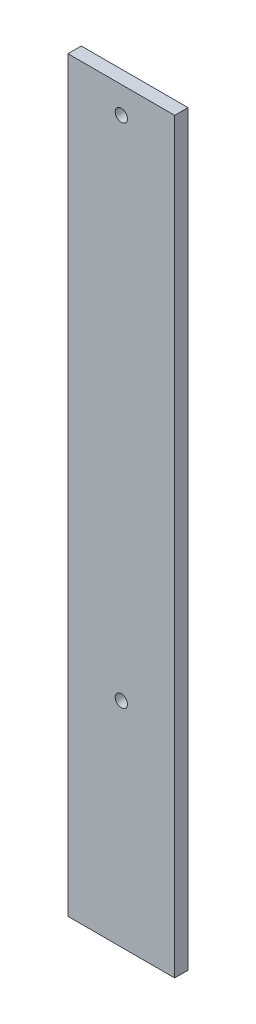
ISO-10303-21;
HEADER;
FILE_DESCRIPTION(('STEP AP214'),'2;1');
FILE_NAME('part.step','',(''),(''),'','','');
FILE_SCHEMA(('AUTOMOTIVE_DESIGN { 1 0 10303 214 1 1 1 1 }'));
ENDSEC;
DATA;
#1=APPLICATION_CONTEXT('core data for automotive mechanical design processes');
#2=APPLICATION_PROTOCOL_DEFINITION('international standard','automotive_design',2000,#1);
#3=PRODUCT_CONTEXT('',#1,'mechanical');
#4=PRODUCT('Part','Part','',(#3));
#5=PRODUCT_RELATED_PRODUCT_CATEGORY('part','',(#4));
#6=PRODUCT_DEFINITION_FORMATION('','',#4);
#7=PRODUCT_DEFINITION_CONTEXT('part definition',#1,'design');
#8=PRODUCT_DEFINITION('design','',#6,#7);
#9=PRODUCT_DEFINITION_SHAPE('','',#8);
#10=(LENGTH_UNIT() NAMED_UNIT(*) SI_UNIT(.MILLI.,.METRE.));
#11=(NAMED_UNIT(*) PLANE_ANGLE_UNIT() SI_UNIT($,.RADIAN.));
#12=(NAMED_UNIT(*) SI_UNIT($,.STERADIAN.) SOLID_ANGLE_UNIT());
#13=UNCERTAINTY_MEASURE_WITH_UNIT(LENGTH_MEASURE(1.E-05),#10,'distance_accuracy_value','');
#14=(GEOMETRIC_REPRESENTATION_CONTEXT(3) GLOBAL_UNCERTAINTY_ASSIGNED_CONTEXT((#13)) GLOBAL_UNIT_ASSIGNED_CONTEXT((#10,
#11,#12)) REPRESENTATION_CONTEXT('',''));
#15=CARTESIAN_POINT('',(0.,0.,0.));
#16=DIRECTION('',(0.,0.,1.));
#17=DIRECTION('',(1.,0.,0.));
#18=AXIS2_PLACEMENT_3D('',#15,#16,#17);
#19=CARTESIAN_POINT('',(0.,0.,3.175));
#20=DIRECTION('',(0.,0.,-1.));
#21=DIRECTION('',(-1.,0.,0.));
#22=AXIS2_PLACEMENT_3D('',#19,#20,#21);
#23=PLANE('',#22);
#24=DIRECTION('',(0.,-1.,0.));
#25=VECTOR('',#24,1.);
#26=CARTESIAN_POINT('',(0.,0.,3.175));
#27=LINE('',#26,#25);
#28=CARTESIAN_POINT('',(0.,177.8,3.175));
#29=VERTEX_POINT('',#28);
#30=CARTESIAN_POINT('',(0.,0.,3.175));
#31=VERTEX_POINT('',#30);
#32=EDGE_CURVE('E98',#29,#31,#27,.T.);
#33=ORIENTED_EDGE('',*,*,#32,.T.);
#34=DIRECTION('',(1.,0.,0.));
#35=VECTOR('',#34,1.);
#36=CARTESIAN_POINT('',(0.,0.,3.175));
#37=LINE('',#36,#35);
#38=CARTESIAN_POINT('',(25.4,0.,3.175));
#39=VERTEX_POINT('',#38);
#40=EDGE_CURVE('E93',#31,#39,#37,.T.);
#41=ORIENTED_EDGE('',*,*,#40,.T.);
#42=DIRECTION('',(0.,1.,0.));
#43=VECTOR('',#42,1.);
#44=CARTESIAN_POINT('',(25.4,0.,3.175));
#45=LINE('',#44,#43);
#46=CARTESIAN_POINT('',(25.4,177.8,3.175));
#47=VERTEX_POINT('',#46);
#48=EDGE_CURVE('E96',#39,#47,#45,.T.);
#49=ORIENTED_EDGE('',*,*,#48,.T.);
#50=DIRECTION('',(-1.,0.,0.));
#51=VECTOR('',#50,1.);
#52=CARTESIAN_POINT('',(0.,177.8,3.175));
#53=LINE('',#52,#51);
#54=EDGE_CURVE('E63',#47,#29,#53,.T.);
#55=ORIENTED_EDGE('',*,*,#54,.T.);
#56=EDGE_LOOP('',(#33,#41,#49,#55));
#57=FACE_BOUND('',#56,.T.);
#58=CARTESIAN_POINT('',(12.7,171.45,3.175));
#59=DIRECTION('',(0.,0.,1.));
#60=DIRECTION('',(1.,0.,0.));
#61=AXIS2_PLACEMENT_3D('',#58,#59,#60);
#62=CIRCLE('',#61,1.4605);
#63=CARTESIAN_POINT('',(14.1605,171.45,3.175));
#64=VERTEX_POINT('',#63);
#65=EDGE_CURVE('E118',#64,#64,#62,.T.);
#66=ORIENTED_EDGE('',*,*,#65,.F.);
#67=EDGE_LOOP('',(#66));
#68=FACE_BOUND('',#67,.T.);
#69=CARTESIAN_POINT('',(12.7,50.8,3.175));
#70=DIRECTION('',(0.,0.,1.));
#71=DIRECTION('',(1.,0.,0.));
#72=AXIS2_PLACEMENT_3D('',#69,#70,#71);
#73=CIRCLE('',#72,1.4605);
#74=CARTESIAN_POINT('',(14.1605,50.8,3.175));
#75=VERTEX_POINT('',#74);
#76=EDGE_CURVE('E140',#75,#75,#73,.T.);
#77=ORIENTED_EDGE('',*,*,#76,.F.);
#78=EDGE_LOOP('',(#77));
#79=FACE_BOUND('',#78,.T.);
#80=ADVANCED_FACE('F45',(#57,#68,#79),#23,.F.);
#81=CARTESIAN_POINT('',(0.,0.,0.));
#82=DIRECTION('',(0.,0.,-1.));
#83=DIRECTION('',(-1.,0.,0.));
#84=AXIS2_PLACEMENT_3D('',#81,#82,#83);
#85=PLANE('',#84);
#86=CARTESIAN_POINT('',(12.7,171.45,0.));
#87=DIRECTION('',(0.,0.,1.));
#88=DIRECTION('',(1.,0.,0.));
#89=AXIS2_PLACEMENT_3D('',#86,#87,#88);
#90=CIRCLE('',#89,1.4605);
#91=CARTESIAN_POINT('',(14.1605,171.45,0.));
#92=VERTEX_POINT('',#91);
#93=EDGE_CURVE('E136',#92,#92,#90,.T.);
#94=ORIENTED_EDGE('',*,*,#93,.T.);
#95=EDGE_LOOP('',(#94));
#96=FACE_BOUND('',#95,.T.);
#97=DIRECTION('',(0.,-1.,0.));
#98=VECTOR('',#97,1.);
#99=CARTESIAN_POINT('',(0.,0.,0.));
#100=LINE('',#99,#98);
#101=CARTESIAN_POINT('',(0.,177.8,0.));
#102=VERTEX_POINT('',#101);
#103=CARTESIAN_POINT('',(0.,0.,0.));
#104=VERTEX_POINT('',#103);
#105=EDGE_CURVE('E114',#102,#104,#100,.T.);
#106=ORIENTED_EDGE('',*,*,#105,.F.);
#107=DIRECTION('',(-1.,0.,0.));
#108=VECTOR('',#107,1.);
#109=CARTESIAN_POINT('',(0.,177.8,0.));
#110=LINE('',#109,#108);
#111=CARTESIAN_POINT('',(25.4,177.8,0.));
#112=VERTEX_POINT('',#111);
#113=EDGE_CURVE('E86',#112,#102,#110,.T.);
#114=ORIENTED_EDGE('',*,*,#113,.F.);
#115=DIRECTION('',(0.,1.,0.));
#116=VECTOR('',#115,1.);
#117=CARTESIAN_POINT('',(25.4,0.,0.));
#118=LINE('',#117,#116);
#119=CARTESIAN_POINT('',(25.4,0.,0.));
#120=VERTEX_POINT('',#119);
#121=EDGE_CURVE('E80',#120,#112,#118,.T.);
#122=ORIENTED_EDGE('',*,*,#121,.F.);
#123=DIRECTION('',(1.,0.,0.));
#124=VECTOR('',#123,1.);
#125=CARTESIAN_POINT('',(0.,0.,0.));
#126=LINE('',#125,#124);
#127=EDGE_CURVE('E103',#104,#120,#126,.T.);
#128=ORIENTED_EDGE('',*,*,#127,.F.);
#129=EDGE_LOOP('',(#106,#114,#122,#128));
#130=FACE_BOUND('',#129,.T.);
#131=CARTESIAN_POINT('',(12.7,50.8,0.));
#132=DIRECTION('',(0.,0.,1.));
#133=DIRECTION('',(1.,0.,0.));
#134=AXIS2_PLACEMENT_3D('',#131,#132,#133);
#135=CIRCLE('',#134,1.4605);
#136=CARTESIAN_POINT('',(14.1605,50.8,0.));
#137=VERTEX_POINT('',#136);
#138=EDGE_CURVE('E144',#137,#137,#135,.T.);
#139=ORIENTED_EDGE('',*,*,#138,.T.);
#140=EDGE_LOOP('',(#139));
#141=FACE_BOUND('',#140,.T.);
#142=ADVANCED_FACE('F131',(#96,#130,#141),#85,.T.);
#143=CARTESIAN_POINT('',(0.,0.,3.175));
#144=DIRECTION('',(1.,0.,0.));
#145=DIRECTION('',(0.,0.,-1.));
#146=AXIS2_PLACEMENT_3D('',#143,#144,#145);
#147=PLANE('',#146);
#148=ORIENTED_EDGE('',*,*,#105,.T.);
#149=DIRECTION('',(0.,0.,-1.));
#150=VECTOR('',#149,1.);
#151=CARTESIAN_POINT('',(0.,0.,3.175));
#152=LINE('',#151,#150);
#153=EDGE_CURVE('E11',#31,#104,#152,.T.);
#154=ORIENTED_EDGE('',*,*,#153,.F.);
#155=ORIENTED_EDGE('',*,*,#32,.F.);
#156=DIRECTION('',(0.,0.,-1.));
#157=VECTOR('',#156,1.);
#158=CARTESIAN_POINT('',(0.,177.8,3.175));
#159=LINE('',#158,#157);
#160=EDGE_CURVE('E110',#29,#102,#159,.T.);
#161=ORIENTED_EDGE('',*,*,#160,.T.);
#162=EDGE_LOOP('',(#148,#154,#155,#161));
#163=FACE_BOUND('',#162,.T.);
#164=ADVANCED_FACE('F47',(#163),#147,.F.);
#165=CARTESIAN_POINT('',(0.,0.,3.175));
#166=DIRECTION('',(0.,1.,0.));
#167=DIRECTION('',(0.,0.,1.));
#168=AXIS2_PLACEMENT_3D('',#165,#166,#167);
#169=PLANE('',#168);
#170=ORIENTED_EDGE('',*,*,#127,.T.);
#171=DIRECTION('',(0.,0.,-1.));
#172=VECTOR('',#171,1.);
#173=CARTESIAN_POINT('',(25.4,0.,3.175));
#174=LINE('',#173,#172);
#175=EDGE_CURVE('E55',#39,#120,#174,.T.);
#176=ORIENTED_EDGE('',*,*,#175,.F.);
#177=ORIENTED_EDGE('',*,*,#40,.F.);
#178=ORIENTED_EDGE('',*,*,#153,.T.);
#179=EDGE_LOOP('',(#170,#176,#177,#178));
#180=FACE_BOUND('',#179,.T.);
#181=ADVANCED_FACE('F102',(#180),#169,.F.);
#182=CARTESIAN_POINT('',(25.4,0.,3.175));
#183=DIRECTION('',(-1.,0.,0.));
#184=DIRECTION('',(0.,-1.,0.));
#185=AXIS2_PLACEMENT_3D('',#182,#183,#184);
#186=PLANE('',#185);
#187=ORIENTED_EDGE('',*,*,#121,.T.);
#188=DIRECTION('',(0.,0.,-1.));
#189=VECTOR('',#188,1.);
#190=CARTESIAN_POINT('',(25.4,177.8,3.175));
#191=LINE('',#190,#189);
#192=EDGE_CURVE('E105',#47,#112,#191,.T.);
#193=ORIENTED_EDGE('',*,*,#192,.F.);
#194=ORIENTED_EDGE('',*,*,#48,.F.);
#195=ORIENTED_EDGE('',*,*,#175,.T.);
#196=EDGE_LOOP('',(#187,#193,#194,#195));
#197=FACE_BOUND('',#196,.T.);
#198=ADVANCED_FACE('F106',(#197),#186,.F.);
#199=CARTESIAN_POINT('',(0.,177.8,3.175));
#200=DIRECTION('',(0.,-1.,0.));
#201=DIRECTION('',(0.,0.,-1.));
#202=AXIS2_PLACEMENT_3D('',#199,#200,#201);
#203=PLANE('',#202);
#204=ORIENTED_EDGE('',*,*,#113,.T.);
#205=ORIENTED_EDGE('',*,*,#160,.F.);
#206=ORIENTED_EDGE('',*,*,#54,.F.);
#207=ORIENTED_EDGE('',*,*,#192,.T.);
#208=EDGE_LOOP('',(#204,#205,#206,#207));
#209=FACE_BOUND('',#208,.T.);
#210=ADVANCED_FACE('F128',(#209),#203,.F.);
#211=CARTESIAN_POINT('',(12.7,171.45,3.175));
#212=DIRECTION('',(0.,0.,-1.));
#213=DIRECTION('',(-1.,0.,0.));
#214=AXIS2_PLACEMENT_3D('',#211,#212,#213);
#215=CYLINDRICAL_SURFACE('',#214,1.4605);
#216=ORIENTED_EDGE('',*,*,#65,.T.);
#217=EDGE_LOOP('',(#216));
#218=FACE_BOUND('',#217,.T.);
#219=ORIENTED_EDGE('',*,*,#93,.F.);
#220=EDGE_LOOP('',(#219));
#221=FACE_BOUND('',#220,.T.);
#222=ADVANCED_FACE('F163',(#218,#221),#215,.F.);
#223=CARTESIAN_POINT('',(12.7,50.8,3.175));
#224=DIRECTION('',(0.,0.,-1.));
#225=DIRECTION('',(-1.,0.,0.));
#226=AXIS2_PLACEMENT_3D('',#223,#224,#225);
#227=CYLINDRICAL_SURFACE('',#226,1.4605);
#228=ORIENTED_EDGE('',*,*,#76,.T.);
#229=EDGE_LOOP('',(#228));
#230=FACE_BOUND('',#229,.T.);
#231=ORIENTED_EDGE('',*,*,#138,.F.);
#232=EDGE_LOOP('',(#231));
#233=FACE_BOUND('',#232,.T.);
#234=ADVANCED_FACE('F152',(#230,#233),#227,.F.);
#235=CLOSED_SHELL('',(#80,#142,#164,#181,#198,#210,#222,#234));
#236=MANIFOLD_SOLID_BREP('B2',#235);
#237=ADVANCED_BREP_SHAPE_REPRESENTATION('',(#18,#236),#14);
#238=SHAPE_DEFINITION_REPRESENTATION(#9,#237);
ENDSEC;
END-ISO-10303-21;
